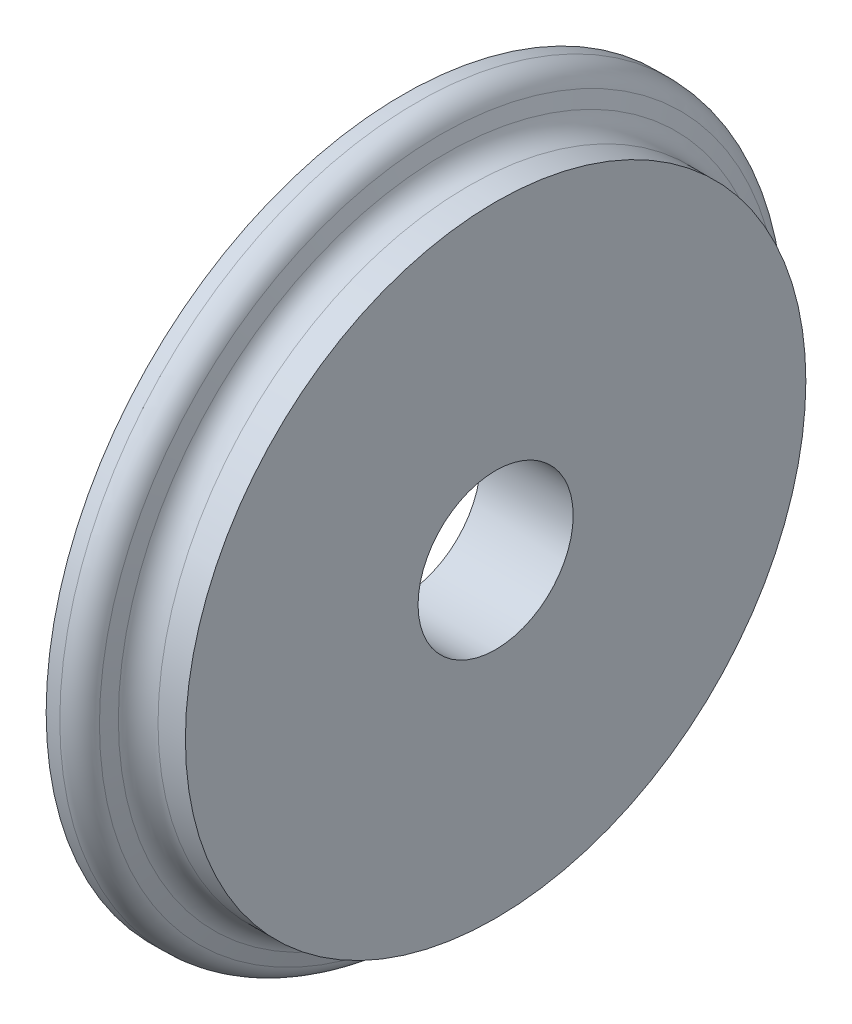
ISO-10303-21;
HEADER;
FILE_DESCRIPTION(('STEP AP214'),'2;1');
FILE_NAME('part.step','',(''),(''),'','','');
FILE_SCHEMA(('AUTOMOTIVE_DESIGN { 1 0 10303 214 1 1 1 1 }'));
ENDSEC;
DATA;
#1=APPLICATION_CONTEXT('core data for automotive mechanical design processes');
#2=APPLICATION_PROTOCOL_DEFINITION('international standard','automotive_design',2000,#1);
#3=PRODUCT_CONTEXT('',#1,'mechanical');
#4=PRODUCT('Part','Part','',(#3));
#5=PRODUCT_RELATED_PRODUCT_CATEGORY('part','',(#4));
#6=PRODUCT_DEFINITION_FORMATION('','',#4);
#7=PRODUCT_DEFINITION_CONTEXT('part definition',#1,'design');
#8=PRODUCT_DEFINITION('design','',#6,#7);
#9=PRODUCT_DEFINITION_SHAPE('','',#8);
#10=(LENGTH_UNIT() NAMED_UNIT(*) SI_UNIT(.MILLI.,.METRE.));
#11=(NAMED_UNIT(*) PLANE_ANGLE_UNIT() SI_UNIT($,.RADIAN.));
#12=(NAMED_UNIT(*) SI_UNIT($,.STERADIAN.) SOLID_ANGLE_UNIT());
#13=UNCERTAINTY_MEASURE_WITH_UNIT(LENGTH_MEASURE(1.E-05),#10,'distance_accuracy_value','');
#14=(GEOMETRIC_REPRESENTATION_CONTEXT(3) GLOBAL_UNCERTAINTY_ASSIGNED_CONTEXT((#13)) GLOBAL_UNIT_ASSIGNED_CONTEXT((#10,
#11,#12)) REPRESENTATION_CONTEXT('',''));
#15=CARTESIAN_POINT('',(0.,0.,0.));
#16=DIRECTION('',(0.,0.,1.));
#17=DIRECTION('',(1.,0.,0.));
#18=AXIS2_PLACEMENT_3D('',#15,#16,#17);
#19=CARTESIAN_POINT('',(12.6632000000032,0.,0.));
#20=DIRECTION('',(1.,0.,0.));
#21=DIRECTION('',(0.,0.,-1.));
#22=AXIS2_PLACEMENT_3D('',#19,#20,#21);
#23=PLANE('',#22);
#24=CARTESIAN_POINT('',(12.6632000000032,0.,0.));
#25=DIRECTION('',(1.,0.,0.));
#26=DIRECTION('',(0.,0.,-1.));
#27=AXIS2_PLACEMENT_3D('',#24,#25,#26);
#28=CIRCLE('',#27,31.75);
#29=CARTESIAN_POINT('',(12.6632000000032,0.,-31.75));
#30=VERTEX_POINT('',#29);
#31=EDGE_CURVE('E46',#30,#30,#28,.T.);
#32=ORIENTED_EDGE('',*,*,#31,.T.);
#33=EDGE_LOOP('',(#32));
#34=FACE_BOUND('',#33,.T.);
#35=CARTESIAN_POINT('',(12.6632000000032,0.,0.));
#36=DIRECTION('',(1.,0.,0.));
#37=DIRECTION('',(0.,0.,-1.));
#38=AXIS2_PLACEMENT_3D('',#35,#36,#37);
#39=CIRCLE('',#38,7.9375);
#40=CARTESIAN_POINT('',(12.6632000000032,0.,-7.9375));
#41=VERTEX_POINT('',#40);
#42=EDGE_CURVE('E34',#41,#41,#39,.F.);
#43=ORIENTED_EDGE('',*,*,#42,.T.);
#44=EDGE_LOOP('',(#43));
#45=FACE_BOUND('',#44,.T.);
#46=ADVANCED_FACE('F30',(#34,#45),#23,.T.);
#47=CARTESIAN_POINT('',(-22.1514000000065,0.,0.));
#48=DIRECTION('',(-1.,0.,0.));
#49=DIRECTION('',(0.,0.,1.));
#50=AXIS2_PLACEMENT_3D('',#47,#48,#49);
#51=CYLINDRICAL_SURFACE('',#50,31.75);
#52=CARTESIAN_POINT('',(9.86193538774544,0.,0.));
#53=DIRECTION('',(-1.,0.,0.));
#54=DIRECTION('',(0.,0.,1.));
#55=AXIS2_PLACEMENT_3D('',#52,#53,#54);
#56=CIRCLE('',#55,31.75);
#57=CARTESIAN_POINT('',(9.86193538774544,0.,31.75));
#58=VERTEX_POINT('',#57);
#59=EDGE_CURVE('E48',#58,#58,#56,.F.);
#60=ORIENTED_EDGE('',*,*,#59,.T.);
#61=EDGE_LOOP('',(#60));
#62=FACE_BOUND('',#61,.T.);
#63=ORIENTED_EDGE('',*,*,#31,.F.);
#64=EDGE_LOOP('',(#63));
#65=FACE_BOUND('',#64,.T.);
#66=ADVANCED_FACE('F32',(#62,#65),#51,.T.);
#67=CARTESIAN_POINT('',(-22.1514000000065,0.,0.));
#68=DIRECTION('',(-1.,0.,0.));
#69=DIRECTION('',(0.,0.,1.));
#70=AXIS2_PLACEMENT_3D('',#67,#68,#69);
#71=CYLINDRICAL_SURFACE('',#70,7.9375);
#72=CARTESIAN_POINT('',(3.175,0.,0.));
#73=DIRECTION('',(-1.,0.,0.));
#74=DIRECTION('',(0.,0.,1.));
#75=AXIS2_PLACEMENT_3D('',#72,#73,#74);
#76=CIRCLE('',#75,7.9375);
#77=CARTESIAN_POINT('',(3.175,0.,7.9375));
#78=VERTEX_POINT('',#77);
#79=EDGE_CURVE('E10',#78,#78,#76,.T.);
#80=ORIENTED_EDGE('',*,*,#79,.T.);
#81=EDGE_LOOP('',(#80));
#82=FACE_BOUND('',#81,.T.);
#83=ORIENTED_EDGE('',*,*,#42,.F.);
#84=EDGE_LOOP('',(#83));
#85=FACE_BOUND('',#84,.T.);
#86=ADVANCED_FACE('F58',(#82,#85),#71,.F.);
#87=CARTESIAN_POINT('',(8.08340824069277,0.,0.));
#88=DIRECTION('',(-1.,0.,0.));
#89=DIRECTION('',(0.,0.,1.));
#90=AXIS2_PLACEMENT_3D('',#87,#88,#89);
#91=CONICAL_SURFACE('',#90,31.75,1.22173047639603);
#92=CARTESIAN_POINT('',(6.95829210974354,0.,0.));
#93=DIRECTION('',(1.,0.,0.));
#94=DIRECTION('',(0.,0.,-1.));
#95=AXIS2_PLACEMENT_3D('',#92,#93,#94);
#96=CIRCLE('',#95,34.8412311640472);
#97=CARTESIAN_POINT('',(6.95829210974354,0.,-34.8412311640472));
#98=VERTEX_POINT('',#97);
#99=EDGE_CURVE('E52',#98,#98,#96,.T.);
#100=ORIENTED_EDGE('',*,*,#99,.T.);
#101=EDGE_LOOP('',(#100));
#102=FACE_BOUND('',#101,.T.);
#103=CARTESIAN_POINT('',(7.47511613094924,0.,0.));
#104=DIRECTION('',(-1.,0.,0.));
#105=DIRECTION('',(0.,0.,1.));
#106=AXIS2_PLACEMENT_3D('',#103,#104,#105);
#107=CIRCLE('',#106,33.4212688359528);
#108=CARTESIAN_POINT('',(7.47511613094924,0.,33.4212688359528));
#109=VERTEX_POINT('',#108);
#110=EDGE_CURVE('E92',#109,#109,#107,.T.);
#111=ORIENTED_EDGE('',*,*,#110,.T.);
#112=EDGE_LOOP('',(#111));
#113=FACE_BOUND('',#112,.T.);
#114=ADVANCED_FACE('F60',(#102,#113),#91,.T.);
#115=CARTESIAN_POINT('',(-22.1514000000065,0.,0.));
#116=DIRECTION('',(-1.,0.,0.));
#117=DIRECTION('',(0.,0.,1.));
#118=AXIS2_PLACEMENT_3D('',#115,#116,#117);
#119=CYLINDRICAL_SURFACE('',#118,36.5125);
#120=CARTESIAN_POINT('',(4.57147285294733,0.,0.));
#121=DIRECTION('',(1.,0.,0.));
#122=DIRECTION('',(0.,0.,-1.));
#123=AXIS2_PLACEMENT_3D('',#120,#121,#122);
#124=CIRCLE('',#123,36.5125);
#125=CARTESIAN_POINT('',(4.57147285294733,0.,-36.5125));
#126=VERTEX_POINT('',#125);
#127=EDGE_CURVE('E43',#126,#126,#124,.F.);
#128=ORIENTED_EDGE('',*,*,#127,.T.);
#129=EDGE_LOOP('',(#128));
#130=FACE_BOUND('',#129,.T.);
#131=CARTESIAN_POINT('',(3.175,0.,0.));
#132=DIRECTION('',(-1.,0.,0.));
#133=DIRECTION('',(0.,0.,1.));
#134=AXIS2_PLACEMENT_3D('',#131,#132,#133);
#135=CIRCLE('',#134,36.5125);
#136=CARTESIAN_POINT('',(3.175,0.,36.5125));
#137=VERTEX_POINT('',#136);
#138=EDGE_CURVE('E38',#137,#137,#135,.T.);
#139=ORIENTED_EDGE('',*,*,#138,.F.);
#140=EDGE_LOOP('',(#139));
#141=FACE_BOUND('',#140,.T.);
#142=ADVANCED_FACE('F65',(#130,#141),#119,.T.);
#143=CARTESIAN_POINT('',(3.175,7.9375,0.));
#144=DIRECTION('',(1.,0.,0.));
#145=DIRECTION('',(0.,0.,-1.));
#146=AXIS2_PLACEMENT_3D('',#143,#144,#145);
#147=PLANE('',#146);
#148=ORIENTED_EDGE('',*,*,#79,.F.);
#149=EDGE_LOOP('',(#148));
#150=FACE_BOUND('',#149,.T.);
#151=ORIENTED_EDGE('',*,*,#138,.T.);
#152=EDGE_LOOP('',(#151));
#153=FACE_BOUND('',#152,.T.);
#154=ADVANCED_FACE('F73',(#150,#153),#147,.F.);
#155=CARTESIAN_POINT('',(4.57147285294733,0.,0.));
#156=DIRECTION('',(1.,0.,0.));
#157=DIRECTION('',(0.,0.,-1.));
#158=AXIS2_PLACEMENT_3D('',#155,#156,#157);
#159=TOROIDAL_SURFACE('',#158,33.9725,2.54);
#160=ORIENTED_EDGE('',*,*,#99,.F.);
#161=EDGE_LOOP('',(#160));
#162=FACE_BOUND('',#161,.T.);
#163=ORIENTED_EDGE('',*,*,#127,.F.);
#164=EDGE_LOOP('',(#163));
#165=FACE_BOUND('',#164,.T.);
#166=ADVANCED_FACE('F76',(#162,#165),#159,.T.);
#167=CARTESIAN_POINT('',(9.86193538774544,0.,0.));
#168=DIRECTION('',(-1.,0.,0.));
#169=DIRECTION('',(0.,0.,1.));
#170=AXIS2_PLACEMENT_3D('',#167,#168,#169);
#171=TOROIDAL_SURFACE('',#170,34.29,2.54);
#172=ORIENTED_EDGE('',*,*,#59,.F.);
#173=EDGE_LOOP('',(#172));
#174=FACE_BOUND('',#173,.T.);
#175=ORIENTED_EDGE('',*,*,#110,.F.);
#176=EDGE_LOOP('',(#175));
#177=FACE_BOUND('',#176,.T.);
#178=ADVANCED_FACE('F72',(#174,#177),#171,.F.);
#179=CLOSED_SHELL('',(#46,#66,#86,#114,#142,#154,#166,#178));
#180=MANIFOLD_SOLID_BREP('B2',#179);
#181=ADVANCED_BREP_SHAPE_REPRESENTATION('',(#18,#180),#14);
#182=SHAPE_DEFINITION_REPRESENTATION(#9,#181);
ENDSEC;
END-ISO-10303-21;
